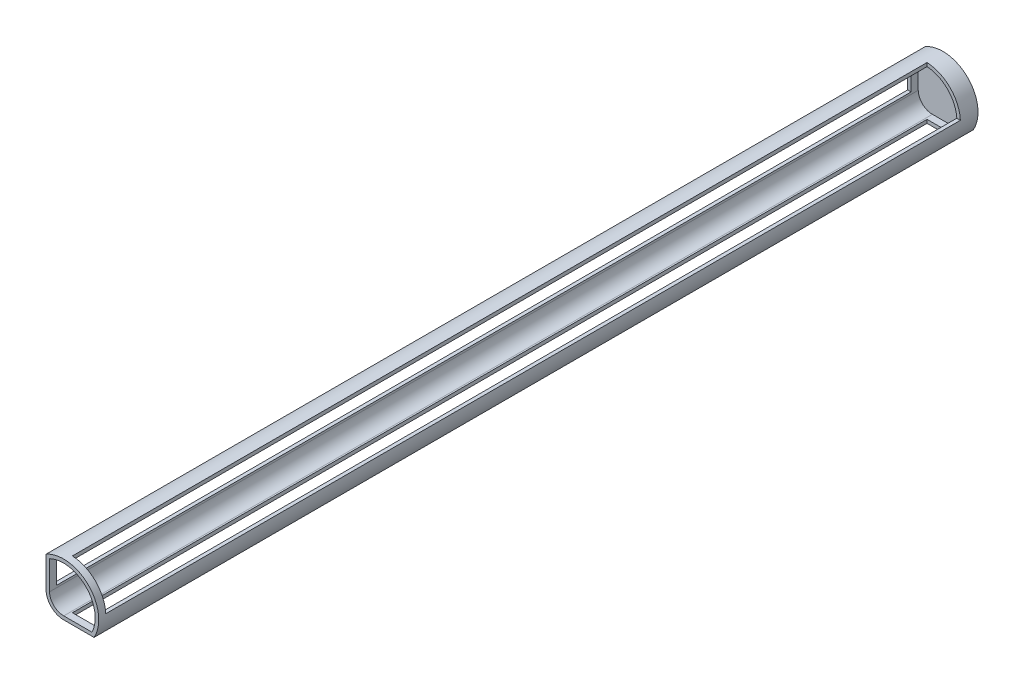
ISO-10303-21;
HEADER;
FILE_DESCRIPTION(('STEP AP214'),'2;1');
FILE_NAME('part.step','',(''),(''),'','','');
FILE_SCHEMA(('AUTOMOTIVE_DESIGN { 1 0 10303 214 1 1 1 1 }'));
ENDSEC;
DATA;
#1=APPLICATION_CONTEXT('core data for automotive mechanical design processes');
#2=APPLICATION_PROTOCOL_DEFINITION('international standard','automotive_design',2000,#1);
#3=PRODUCT_CONTEXT('',#1,'mechanical');
#4=PRODUCT('Part','Part','',(#3));
#5=PRODUCT_RELATED_PRODUCT_CATEGORY('part','',(#4));
#6=PRODUCT_DEFINITION_FORMATION('','',#4);
#7=PRODUCT_DEFINITION_CONTEXT('part definition',#1,'design');
#8=PRODUCT_DEFINITION('design','',#6,#7);
#9=PRODUCT_DEFINITION_SHAPE('','',#8);
#10=(LENGTH_UNIT() NAMED_UNIT(*) SI_UNIT(.MILLI.,.METRE.));
#11=(NAMED_UNIT(*) PLANE_ANGLE_UNIT() SI_UNIT($,.RADIAN.));
#12=(NAMED_UNIT(*) SI_UNIT($,.STERADIAN.) SOLID_ANGLE_UNIT());
#13=UNCERTAINTY_MEASURE_WITH_UNIT(LENGTH_MEASURE(1.E-05),#10,'distance_accuracy_value','');
#14=(GEOMETRIC_REPRESENTATION_CONTEXT(3) GLOBAL_UNCERTAINTY_ASSIGNED_CONTEXT((#13)) GLOBAL_UNIT_ASSIGNED_CONTEXT((#10,
#11,#12)) REPRESENTATION_CONTEXT('',''));
#15=CARTESIAN_POINT('',(0.,0.,0.));
#16=DIRECTION('',(0.,0.,1.));
#17=DIRECTION('',(1.,0.,0.));
#18=AXIS2_PLACEMENT_3D('',#15,#16,#17);
#19=CARTESIAN_POINT('',(-2.49999999999997,-2.5,250.));
#20=DIRECTION('',(0.,0.,-1.));
#21=DIRECTION('',(-1.,0.,0.));
#22=AXIS2_PLACEMENT_3D('',#19,#20,#21);
#23=CYLINDRICAL_SURFACE('',#22,9.99999999999999);
#24=DIRECTION('',(0.,0.,-1.));
#25=VECTOR('',#24,1.);
#26=CARTESIAN_POINT('',(7.48749217771911,-2.00000000000003,250.));
#27=LINE('',#26,#25);
#28=CARTESIAN_POINT('',(7.48749217771911,-2.00000000000003,5.));
#29=VERTEX_POINT('',#28);
#30=CARTESIAN_POINT('',(7.4874921777191,-2.00000000000003,248.));
#31=VERTEX_POINT('',#30);
#32=EDGE_CURVE('E231',#29,#31,#27,.F.);
#33=ORIENTED_EDGE('',*,*,#32,.T.);
#34=CARTESIAN_POINT('',(-2.49999999999997,-2.5,248.));
#35=DIRECTION('',(0.,0.,1.));
#36=DIRECTION('',(1.,0.,0.));
#37=AXIS2_PLACEMENT_3D('',#34,#35,#36);
#38=CIRCLE('',#37,9.99999999999999);
#39=CARTESIAN_POINT('',(-2.00000000000003,7.48749217771908,248.));
#40=VERTEX_POINT('',#39);
#41=EDGE_CURVE('E268',#31,#40,#38,.T.);
#42=ORIENTED_EDGE('',*,*,#41,.T.);
#43=DIRECTION('',(0.,0.,-1.));
#44=VECTOR('',#43,1.);
#45=CARTESIAN_POINT('',(-2.00000000000003,7.48749217771908,250.));
#46=LINE('',#45,#44);
#47=CARTESIAN_POINT('',(-2.,7.48749217771907,5.));
#48=VERTEX_POINT('',#47);
#49=EDGE_CURVE('E275',#40,#48,#46,.T.);
#50=ORIENTED_EDGE('',*,*,#49,.T.);
#51=CARTESIAN_POINT('',(-2.49999999999997,-2.5,5.));
#52=DIRECTION('',(0.,0.,-1.));
#53=DIRECTION('',(-1.,0.,0.));
#54=AXIS2_PLACEMENT_3D('',#51,#52,#53);
#55=CIRCLE('',#54,9.99999999999999);
#56=EDGE_CURVE('E282',#48,#29,#55,.T.);
#57=ORIENTED_EDGE('',*,*,#56,.T.);
#58=EDGE_LOOP('',(#33,#42,#50,#57));
#59=FACE_BOUND('',#58,.T.);
#60=CARTESIAN_POINT('',(-2.49999999999997,-2.5,0.));
#61=DIRECTION('',(0.,0.,1.));
#62=DIRECTION('',(-1.,0.,0.));
#63=AXIS2_PLACEMENT_3D('',#60,#61,#62);
#64=CIRCLE('',#63,9.99999999999999);
#65=CARTESIAN_POINT('',(6.16025403784441,-7.49999999999999,0.));
#66=VERTEX_POINT('',#65);
#67=CARTESIAN_POINT('',(-7.50000000000002,6.16025403784435,0.));
#68=VERTEX_POINT('',#67);
#69=EDGE_CURVE('E319',#66,#68,#64,.T.);
#70=ORIENTED_EDGE('',*,*,#69,.T.);
#71=DIRECTION('',(0.,0.,-1.));
#72=VECTOR('',#71,1.);
#73=CARTESIAN_POINT('',(-7.50000000000002,6.16025403784435,250.));
#74=LINE('',#73,#72);
#75=CARTESIAN_POINT('',(-7.50000000000002,6.16025403784435,250.));
#76=VERTEX_POINT('',#75);
#77=EDGE_CURVE('E366',#76,#68,#74,.T.);
#78=ORIENTED_EDGE('',*,*,#77,.F.);
#79=CARTESIAN_POINT('',(-2.49999999999997,-2.5,250.));
#80=DIRECTION('',(0.,0.,1.));
#81=DIRECTION('',(-1.,0.,0.));
#82=AXIS2_PLACEMENT_3D('',#79,#80,#81);
#83=CIRCLE('',#82,9.99999999999999);
#84=CARTESIAN_POINT('',(6.16025403784441,-7.49999999999999,250.));
#85=VERTEX_POINT('',#84);
#86=EDGE_CURVE('E329',#85,#76,#83,.T.);
#87=ORIENTED_EDGE('',*,*,#86,.F.);
#88=DIRECTION('',(0.,0.,-1.));
#89=VECTOR('',#88,1.);
#90=CARTESIAN_POINT('',(6.16025403784441,-7.49999999999999,250.));
#91=LINE('',#90,#89);
#92=EDGE_CURVE('E343',#85,#66,#91,.T.);
#93=ORIENTED_EDGE('',*,*,#92,.T.);
#94=EDGE_LOOP('',(#70,#78,#87,#93));
#95=FACE_BOUND('',#94,.T.);
#96=ADVANCED_FACE('F44',(#59,#95),#23,.T.);
#97=CARTESIAN_POINT('',(-7.50000000000002,6.16025403784435,250.));
#98=DIRECTION('',(1.,0.,0.));
#99=DIRECTION('',(0.,0.,-1.));
#100=AXIS2_PLACEMENT_3D('',#97,#98,#99);
#101=PLANE('',#100);
#102=DIRECTION('',(0.,0.,-1.));
#103=VECTOR('',#102,1.);
#104=CARTESIAN_POINT('',(-7.50000000000002,5.49999999999997,5.));
#105=LINE('',#104,#103);
#106=CARTESIAN_POINT('',(-7.50000000000002,5.49999999999997,248.));
#107=VERTEX_POINT('',#106);
#108=CARTESIAN_POINT('',(-7.50000000000002,5.49999999999997,5.));
#109=VERTEX_POINT('',#108);
#110=EDGE_CURVE('E194',#107,#109,#105,.T.);
#111=ORIENTED_EDGE('',*,*,#110,.F.);
#112=DIRECTION('',(0.,1.,0.));
#113=VECTOR('',#112,1.);
#114=CARTESIAN_POINT('',(-7.50000000000002,5.49999999999997,248.));
#115=LINE('',#114,#113);
#116=CARTESIAN_POINT('',(-7.50000000000002,-2.00000000000003,248.));
#117=VERTEX_POINT('',#116);
#118=EDGE_CURVE('E59',#117,#107,#115,.T.);
#119=ORIENTED_EDGE('',*,*,#118,.F.);
#120=DIRECTION('',(0.,0.,1.));
#121=VECTOR('',#120,1.);
#122=CARTESIAN_POINT('',(-7.50000000000002,-2.00000000000003,5.));
#123=LINE('',#122,#121);
#124=CARTESIAN_POINT('',(-7.50000000000002,-2.00000000000003,5.));
#125=VERTEX_POINT('',#124);
#126=EDGE_CURVE('E202',#125,#117,#123,.T.);
#127=ORIENTED_EDGE('',*,*,#126,.F.);
#128=DIRECTION('',(0.,-1.,0.));
#129=VECTOR('',#128,1.);
#130=CARTESIAN_POINT('',(-7.50000000000002,5.49999999999997,5.));
#131=LINE('',#130,#129);
#132=EDGE_CURVE('E184',#109,#125,#131,.T.);
#133=ORIENTED_EDGE('',*,*,#132,.F.);
#134=EDGE_LOOP('',(#111,#119,#127,#133));
#135=FACE_BOUND('',#134,.T.);
#136=DIRECTION('',(0.,-1.,0.));
#137=VECTOR('',#136,1.);
#138=CARTESIAN_POINT('',(-7.50000000000002,6.16025403784435,0.));
#139=LINE('',#138,#137);
#140=CARTESIAN_POINT('',(-7.50000000000002,-2.50000000000003,0.));
#141=VERTEX_POINT('',#140);
#142=EDGE_CURVE('E347',#68,#141,#139,.T.);
#143=ORIENTED_EDGE('',*,*,#142,.T.);
#144=DIRECTION('',(0.,0.,-1.));
#145=VECTOR('',#144,1.);
#146=CARTESIAN_POINT('',(-7.50000000000002,-2.50000000000003,250.));
#147=LINE('',#146,#145);
#148=CARTESIAN_POINT('',(-7.50000000000002,-2.50000000000003,250.));
#149=VERTEX_POINT('',#148);
#150=EDGE_CURVE('E362',#149,#141,#147,.T.);
#151=ORIENTED_EDGE('',*,*,#150,.F.);
#152=DIRECTION('',(0.,-1.,0.));
#153=VECTOR('',#152,1.);
#154=CARTESIAN_POINT('',(-7.50000000000002,6.16025403784435,250.));
#155=LINE('',#154,#153);
#156=EDGE_CURVE('E333',#76,#149,#155,.T.);
#157=ORIENTED_EDGE('',*,*,#156,.F.);
#158=ORIENTED_EDGE('',*,*,#77,.T.);
#159=EDGE_LOOP('',(#143,#151,#157,#158));
#160=FACE_BOUND('',#159,.T.);
#161=ADVANCED_FACE('F199',(#135,#160),#101,.F.);
#162=CARTESIAN_POINT('',(-2.50000000000003,-2.5,250.));
#163=DIRECTION('',(0.,0.,-1.));
#164=DIRECTION('',(-1.,0.,0.));
#165=AXIS2_PLACEMENT_3D('',#162,#163,#164);
#166=CYLINDRICAL_SURFACE('',#165,4.99999999999999);
#167=CARTESIAN_POINT('',(-2.50000000000003,-2.5,0.));
#168=DIRECTION('',(0.,0.,1.));
#169=DIRECTION('',(-1.,0.,0.));
#170=AXIS2_PLACEMENT_3D('',#167,#168,#169);
#171=CIRCLE('',#170,4.99999999999999);
#172=CARTESIAN_POINT('',(-2.50000000000003,-7.49999999999999,0.));
#173=VERTEX_POINT('',#172);
#174=EDGE_CURVE('E350',#141,#173,#171,.T.);
#175=ORIENTED_EDGE('',*,*,#174,.T.);
#176=DIRECTION('',(0.,0.,-1.));
#177=VECTOR('',#176,1.);
#178=CARTESIAN_POINT('',(-2.50000000000003,-7.49999999999999,250.));
#179=LINE('',#178,#177);
#180=CARTESIAN_POINT('',(-2.50000000000003,-7.49999999999999,250.));
#181=VERTEX_POINT('',#180);
#182=EDGE_CURVE('E358',#181,#173,#179,.T.);
#183=ORIENTED_EDGE('',*,*,#182,.F.);
#184=CARTESIAN_POINT('',(-2.50000000000003,-2.5,250.));
#185=DIRECTION('',(0.,0.,1.));
#186=DIRECTION('',(-1.,0.,0.));
#187=AXIS2_PLACEMENT_3D('',#184,#185,#186);
#188=CIRCLE('',#187,4.99999999999999);
#189=EDGE_CURVE('E337',#149,#181,#188,.T.);
#190=ORIENTED_EDGE('',*,*,#189,.F.);
#191=ORIENTED_EDGE('',*,*,#150,.T.);
#192=EDGE_LOOP('',(#175,#183,#190,#191));
#193=FACE_BOUND('',#192,.T.);
#194=ADVANCED_FACE('F424',(#193),#166,.T.);
#195=CARTESIAN_POINT('',(6.16025403784441,-7.49999999999999,250.));
#196=DIRECTION('',(0.,1.,0.));
#197=DIRECTION('',(0.,0.,1.));
#198=AXIS2_PLACEMENT_3D('',#195,#196,#197);
#199=PLANE('',#198);
#200=DIRECTION('',(-1.,0.,0.));
#201=VECTOR('',#200,1.);
#202=CARTESIAN_POINT('',(-2.00000000000003,-7.49999999999999,248.));
#203=LINE('',#202,#201);
#204=CARTESIAN_POINT('',(5.49999999999997,-7.49999999999999,248.));
#205=VERTEX_POINT('',#204);
#206=CARTESIAN_POINT('',(-2.00000000000003,-7.49999999999999,248.));
#207=VERTEX_POINT('',#206);
#208=EDGE_CURVE('E238',#205,#207,#203,.T.);
#209=ORIENTED_EDGE('',*,*,#208,.F.);
#210=DIRECTION('',(0.,0.,1.));
#211=VECTOR('',#210,1.);
#212=CARTESIAN_POINT('',(5.49999999999997,-7.49999999999999,248.));
#213=LINE('',#212,#211);
#214=CARTESIAN_POINT('',(5.5,-7.49999999999999,5.));
#215=VERTEX_POINT('',#214);
#216=EDGE_CURVE('E235',#215,#205,#213,.T.);
#217=ORIENTED_EDGE('',*,*,#216,.F.);
#218=DIRECTION('',(1.,0.,0.));
#219=VECTOR('',#218,1.);
#220=CARTESIAN_POINT('',(-2.,-7.49999999999999,5.));
#221=LINE('',#220,#219);
#222=CARTESIAN_POINT('',(-2.,-7.49999999999999,5.));
#223=VERTEX_POINT('',#222);
#224=EDGE_CURVE('E246',#223,#215,#221,.T.);
#225=ORIENTED_EDGE('',*,*,#224,.F.);
#226=DIRECTION('',(0.,0.,-1.));
#227=VECTOR('',#226,1.);
#228=CARTESIAN_POINT('',(-2.00000000000003,-7.49999999999999,248.));
#229=LINE('',#228,#227);
#230=EDGE_CURVE('E242',#207,#223,#229,.T.);
#231=ORIENTED_EDGE('',*,*,#230,.F.);
#232=EDGE_LOOP('',(#209,#217,#225,#231));
#233=FACE_BOUND('',#232,.T.);
#234=DIRECTION('',(1.,0.,0.));
#235=VECTOR('',#234,1.);
#236=CARTESIAN_POINT('',(6.16025403784441,-7.49999999999999,0.));
#237=LINE('',#236,#235);
#238=EDGE_CURVE('E334',#173,#66,#237,.T.);
#239=ORIENTED_EDGE('',*,*,#238,.T.);
#240=ORIENTED_EDGE('',*,*,#92,.F.);
#241=DIRECTION('',(1.,0.,0.));
#242=VECTOR('',#241,1.);
#243=CARTESIAN_POINT('',(6.16025403784441,-7.49999999999999,250.));
#244=LINE('',#243,#242);
#245=EDGE_CURVE('E340',#181,#85,#244,.T.);
#246=ORIENTED_EDGE('',*,*,#245,.F.);
#247=ORIENTED_EDGE('',*,*,#182,.T.);
#248=EDGE_LOOP('',(#239,#240,#246,#247));
#249=FACE_BOUND('',#248,.T.);
#250=ADVANCED_FACE('F398',(#233,#249),#199,.F.);
#251=CARTESIAN_POINT('',(-2.49999999999997,-2.5,250.));
#252=DIRECTION('',(0.,0.,-1.));
#253=DIRECTION('',(-1.,0.,0.));
#254=AXIS2_PLACEMENT_3D('',#251,#252,#253);
#255=PLANE('',#254);
#256=DIRECTION('',(1.,0.,0.));
#257=VECTOR('',#256,1.);
#258=CARTESIAN_POINT('',(0.796633641706377,-6.49999999999999,250.));
#259=LINE('',#258,#257);
#260=CARTESIAN_POINT('',(-2.45808929458799,-6.49999999999999,250.));
#261=VERTEX_POINT('',#260);
#262=CARTESIAN_POINT('',(5.56225774829857,-6.49999999999999,250.));
#263=VERTEX_POINT('',#262);
#264=EDGE_CURVE('E305',#261,#263,#259,.T.);
#265=ORIENTED_EDGE('',*,*,#264,.F.);
#266=CARTESIAN_POINT('',(-2.52660242536345,-2.52660242536343,250.));
#267=DIRECTION('',(0.,0.,1.));
#268=DIRECTION('',(1.,0.,0.));
#269=AXIS2_PLACEMENT_3D('',#266,#267,#268);
#270=CIRCLE('',#269,3.97398821528404);
#271=CARTESIAN_POINT('',(-6.50000000000002,-2.5951155561389,250.));
#272=VERTEX_POINT('',#271);
#273=EDGE_CURVE('E285',#272,#261,#270,.T.);
#274=ORIENTED_EDGE('',*,*,#273,.F.);
#275=DIRECTION('',(0.,-1.,0.));
#276=VECTOR('',#275,1.);
#277=CARTESIAN_POINT('',(-6.50000000000002,5.56225774829852,250.));
#278=LINE('',#277,#276);
#279=CARTESIAN_POINT('',(-6.50000000000002,5.56225774829852,250.));
#280=VERTEX_POINT('',#279);
#281=EDGE_CURVE('E291',#280,#272,#278,.T.);
#282=ORIENTED_EDGE('',*,*,#281,.F.);
#283=CARTESIAN_POINT('',(-2.52766398036111,-2.52766398036114,250.));
#284=DIRECTION('',(0.,0.,1.));
#285=DIRECTION('',(-1.,0.,0.));
#286=AXIS2_PLACEMENT_3D('',#283,#284,#285);
#287=CIRCLE('',#286,9.01256273369347);
#288=EDGE_CURVE('E309',#263,#280,#287,.T.);
#289=ORIENTED_EDGE('',*,*,#288,.F.);
#290=EDGE_LOOP('',(#265,#274,#282,#289));
#291=FACE_BOUND('',#290,.T.);
#292=ORIENTED_EDGE('',*,*,#86,.T.);
#293=ORIENTED_EDGE('',*,*,#156,.T.);
#294=ORIENTED_EDGE('',*,*,#189,.T.);
#295=ORIENTED_EDGE('',*,*,#245,.T.);
#296=EDGE_LOOP('',(#292,#293,#294,#295));
#297=FACE_BOUND('',#296,.T.);
#298=ADVANCED_FACE('F438',(#291,#297),#255,.F.);
#299=CARTESIAN_POINT('',(-2.49999999999997,-2.5,0.));
#300=DIRECTION('',(0.,0.,-1.));
#301=DIRECTION('',(-1.,0.,0.));
#302=AXIS2_PLACEMENT_3D('',#299,#300,#301);
#303=PLANE('',#302);
#304=ORIENTED_EDGE('',*,*,#69,.F.);
#305=ORIENTED_EDGE('',*,*,#238,.F.);
#306=ORIENTED_EDGE('',*,*,#174,.F.);
#307=ORIENTED_EDGE('',*,*,#142,.F.);
#308=EDGE_LOOP('',(#304,#305,#306,#307));
#309=FACE_BOUND('',#308,.T.);
#310=ADVANCED_FACE('F433',(#309),#303,.T.);
#311=CARTESIAN_POINT('',(-2.52660242536345,-2.52660242536343,3.));
#312=DIRECTION('',(0.,0.,1.));
#313=DIRECTION('',(1.,0.,0.));
#314=AXIS2_PLACEMENT_3D('',#311,#312,#313);
#315=CYLINDRICAL_SURFACE('',#314,3.97398821528404);
#316=ORIENTED_EDGE('',*,*,#273,.T.);
#317=DIRECTION('',(0.,0.,1.));
#318=VECTOR('',#317,1.);
#319=CARTESIAN_POINT('',(-2.45808929458799,-6.49999999999999,3.));
#320=LINE('',#319,#318);
#321=CARTESIAN_POINT('',(-2.45808929458799,-6.49999999999999,3.));
#322=VERTEX_POINT('',#321);
#323=EDGE_CURVE('E302',#322,#261,#320,.T.);
#324=ORIENTED_EDGE('',*,*,#323,.F.);
#325=CARTESIAN_POINT('',(-2.52660242536345,-2.52660242536343,3.));
#326=DIRECTION('',(0.,0.,1.));
#327=DIRECTION('',(1.,0.,0.));
#328=AXIS2_PLACEMENT_3D('',#325,#326,#327);
#329=CIRCLE('',#328,3.97398821528404);
#330=CARTESIAN_POINT('',(-6.50000000000002,-2.5951155561389,3.));
#331=VERTEX_POINT('',#330);
#332=EDGE_CURVE('E286',#331,#322,#329,.T.);
#333=ORIENTED_EDGE('',*,*,#332,.F.);
#334=DIRECTION('',(0.,0.,1.));
#335=VECTOR('',#334,1.);
#336=CARTESIAN_POINT('',(-6.50000000000002,-2.5951155561389,3.));
#337=LINE('',#336,#335);
#338=EDGE_CURVE('E316',#331,#272,#337,.T.);
#339=ORIENTED_EDGE('',*,*,#338,.T.);
#340=EDGE_LOOP('',(#316,#324,#333,#339));
#341=FACE_BOUND('',#340,.T.);
#342=ADVANCED_FACE('F451',(#341),#315,.F.);
#343=CARTESIAN_POINT('',(-6.50000000000002,5.56225774829852,3.));
#344=DIRECTION('',(-1.,0.,0.));
#345=DIRECTION('',(0.,0.,1.));
#346=AXIS2_PLACEMENT_3D('',#343,#344,#345);
#347=PLANE('',#346);
#348=DIRECTION('',(0.,0.,1.));
#349=VECTOR('',#348,1.);
#350=CARTESIAN_POINT('',(-6.50000000000002,-2.00000000000003,3.));
#351=LINE('',#350,#349);
#352=CARTESIAN_POINT('',(-6.50000000000003,-2.00000000000003,5.));
#353=VERTEX_POINT('',#352);
#354=CARTESIAN_POINT('',(-6.50000000000003,-2.00000000000003,248.));
#355=VERTEX_POINT('',#354);
#356=EDGE_CURVE('E227',#353,#355,#351,.T.);
#357=ORIENTED_EDGE('',*,*,#356,.T.);
#358=DIRECTION('',(0.,1.,0.));
#359=VECTOR('',#358,1.);
#360=CARTESIAN_POINT('',(-6.50000000000002,5.56225774829852,248.));
#361=LINE('',#360,#359);
#362=CARTESIAN_POINT('',(-6.50000000000003,5.49999999999997,248.));
#363=VERTEX_POINT('',#362);
#364=EDGE_CURVE('E223',#355,#363,#361,.T.);
#365=ORIENTED_EDGE('',*,*,#364,.T.);
#366=DIRECTION('',(0.,0.,-1.));
#367=VECTOR('',#366,1.);
#368=CARTESIAN_POINT('',(-6.50000000000002,5.49999999999997,3.));
#369=LINE('',#368,#367);
#370=CARTESIAN_POINT('',(-6.50000000000002,5.49999999999997,5.));
#371=VERTEX_POINT('',#370);
#372=EDGE_CURVE('E218',#363,#371,#369,.T.);
#373=ORIENTED_EDGE('',*,*,#372,.T.);
#374=DIRECTION('',(0.,-1.,0.));
#375=VECTOR('',#374,1.);
#376=CARTESIAN_POINT('',(-6.50000000000002,5.56225774829852,5.));
#377=LINE('',#376,#375);
#378=EDGE_CURVE('E187',#371,#353,#377,.T.);
#379=ORIENTED_EDGE('',*,*,#378,.T.);
#380=EDGE_LOOP('',(#357,#365,#373,#379));
#381=FACE_BOUND('',#380,.T.);
#382=ORIENTED_EDGE('',*,*,#281,.T.);
#383=ORIENTED_EDGE('',*,*,#338,.F.);
#384=DIRECTION('',(0.,-1.,0.));
#385=VECTOR('',#384,1.);
#386=CARTESIAN_POINT('',(-6.50000000000002,5.56225774829852,3.));
#387=LINE('',#386,#385);
#388=CARTESIAN_POINT('',(-6.50000000000002,5.56225774829852,3.));
#389=VERTEX_POINT('',#388);
#390=EDGE_CURVE('E298',#389,#331,#387,.T.);
#391=ORIENTED_EDGE('',*,*,#390,.F.);
#392=DIRECTION('',(0.,0.,1.));
#393=VECTOR('',#392,1.);
#394=CARTESIAN_POINT('',(-6.50000000000002,5.56225774829852,3.));
#395=LINE('',#394,#393);
#396=EDGE_CURVE('E320',#389,#280,#395,.T.);
#397=ORIENTED_EDGE('',*,*,#396,.T.);
#398=EDGE_LOOP('',(#382,#383,#391,#397));
#399=FACE_BOUND('',#398,.T.);
#400=ADVANCED_FACE('F457',(#381,#399),#347,.F.);
#401=CARTESIAN_POINT('',(-2.52766398036111,-2.52766398036114,3.));
#402=DIRECTION('',(0.,0.,1.));
#403=DIRECTION('',(1.,0.,0.));
#404=AXIS2_PLACEMENT_3D('',#401,#402,#403);
#405=CYLINDRICAL_SURFACE('',#404,9.01256273369347);
#406=CARTESIAN_POINT('',(-2.52766398036111,-2.52766398036114,248.));
#407=DIRECTION('',(0.,0.,1.));
#408=DIRECTION('',(1.,0.,0.));
#409=AXIS2_PLACEMENT_3D('',#406,#407,#408);
#410=CIRCLE('',#409,9.01256273369347);
#411=CARTESIAN_POINT('',(-2.00000000000003,6.46943876177701,248.));
#412=VERTEX_POINT('',#411);
#413=CARTESIAN_POINT('',(6.46943876177702,-2.00000000000003,248.));
#414=VERTEX_POINT('',#413);
#415=EDGE_CURVE('E254',#412,#414,#410,.F.);
#416=ORIENTED_EDGE('',*,*,#415,.T.);
#417=DIRECTION('',(0.,0.,1.));
#418=VECTOR('',#417,1.);
#419=CARTESIAN_POINT('',(6.46943876177704,-2.00000000000003,3.));
#420=LINE('',#419,#418);
#421=CARTESIAN_POINT('',(6.46943876177704,-2.00000000000003,5.));
#422=VERTEX_POINT('',#421);
#423=EDGE_CURVE('E11',#414,#422,#420,.F.);
#424=ORIENTED_EDGE('',*,*,#423,.T.);
#425=CARTESIAN_POINT('',(-2.52766398036111,-2.52766398036114,5.));
#426=DIRECTION('',(0.,0.,-1.));
#427=DIRECTION('',(-1.,0.,0.));
#428=AXIS2_PLACEMENT_3D('',#425,#426,#427);
#429=CIRCLE('',#428,9.01256273369347);
#430=CARTESIAN_POINT('',(-2.,6.46943876177702,5.));
#431=VERTEX_POINT('',#430);
#432=EDGE_CURVE('E279',#422,#431,#429,.F.);
#433=ORIENTED_EDGE('',*,*,#432,.T.);
#434=DIRECTION('',(0.,0.,1.));
#435=VECTOR('',#434,1.);
#436=CARTESIAN_POINT('',(-2.,6.46943876177701,3.));
#437=LINE('',#436,#435);
#438=EDGE_CURVE('E271',#431,#412,#437,.T.);
#439=ORIENTED_EDGE('',*,*,#438,.T.);
#440=EDGE_LOOP('',(#416,#424,#433,#439));
#441=FACE_BOUND('',#440,.T.);
#442=ORIENTED_EDGE('',*,*,#288,.T.);
#443=ORIENTED_EDGE('',*,*,#396,.F.);
#444=CARTESIAN_POINT('',(-2.52766398036111,-2.52766398036114,3.));
#445=DIRECTION('',(0.,0.,1.));
#446=DIRECTION('',(-1.,0.,0.));
#447=AXIS2_PLACEMENT_3D('',#444,#445,#446);
#448=CIRCLE('',#447,9.01256273369347);
#449=CARTESIAN_POINT('',(5.56225774829857,-6.49999999999999,3.));
#450=VERTEX_POINT('',#449);
#451=EDGE_CURVE('E294',#450,#389,#448,.T.);
#452=ORIENTED_EDGE('',*,*,#451,.F.);
#453=DIRECTION('',(0.,0.,1.));
#454=VECTOR('',#453,1.);
#455=CARTESIAN_POINT('',(5.56225774829857,-6.49999999999999,3.));
#456=LINE('',#455,#454);
#457=EDGE_CURVE('E323',#450,#263,#456,.T.);
#458=ORIENTED_EDGE('',*,*,#457,.T.);
#459=EDGE_LOOP('',(#442,#443,#452,#458));
#460=FACE_BOUND('',#459,.T.);
#461=ADVANCED_FACE('F461',(#441,#460),#405,.F.);
#462=CARTESIAN_POINT('',(0.796633641706377,-6.49999999999999,3.));
#463=DIRECTION('',(0.,-1.,0.));
#464=DIRECTION('',(0.,0.,-1.));
#465=AXIS2_PLACEMENT_3D('',#462,#463,#464);
#466=PLANE('',#465);
#467=DIRECTION('',(1.,0.,0.));
#468=VECTOR('',#467,1.);
#469=CARTESIAN_POINT('',(0.796633641706377,-6.49999999999999,5.));
#470=LINE('',#469,#468);
#471=CARTESIAN_POINT('',(-2.,-6.50000000000001,5.));
#472=VERTEX_POINT('',#471);
#473=CARTESIAN_POINT('',(5.5,-6.50000000000001,5.));
#474=VERTEX_POINT('',#473);
#475=EDGE_CURVE('E378',#472,#474,#470,.T.);
#476=ORIENTED_EDGE('',*,*,#475,.T.);
#477=DIRECTION('',(0.,0.,1.));
#478=VECTOR('',#477,1.);
#479=CARTESIAN_POINT('',(5.5,-6.49999999999999,3.));
#480=LINE('',#479,#478);
#481=CARTESIAN_POINT('',(5.49999999999997,-6.50000000000001,248.));
#482=VERTEX_POINT('',#481);
#483=EDGE_CURVE('E52',#474,#482,#480,.T.);
#484=ORIENTED_EDGE('',*,*,#483,.T.);
#485=DIRECTION('',(-1.,0.,0.));
#486=VECTOR('',#485,1.);
#487=CARTESIAN_POINT('',(0.796633641706377,-6.49999999999999,248.));
#488=LINE('',#487,#486);
#489=CARTESIAN_POINT('',(-2.00000000000003,-6.49999999999999,248.));
#490=VERTEX_POINT('',#489);
#491=EDGE_CURVE('E370',#482,#490,#488,.T.);
#492=ORIENTED_EDGE('',*,*,#491,.T.);
#493=DIRECTION('',(0.,0.,-1.));
#494=VECTOR('',#493,1.);
#495=CARTESIAN_POINT('',(-2.,-6.49999999999999,3.));
#496=LINE('',#495,#494);
#497=EDGE_CURVE('E374',#490,#472,#496,.T.);
#498=ORIENTED_EDGE('',*,*,#497,.T.);
#499=EDGE_LOOP('',(#476,#484,#492,#498));
#500=FACE_BOUND('',#499,.T.);
#501=ORIENTED_EDGE('',*,*,#264,.T.);
#502=ORIENTED_EDGE('',*,*,#457,.F.);
#503=DIRECTION('',(1.,0.,0.));
#504=VECTOR('',#503,1.);
#505=CARTESIAN_POINT('',(0.796633641706377,-6.49999999999999,3.));
#506=LINE('',#505,#504);
#507=EDGE_CURVE('E290',#322,#450,#506,.T.);
#508=ORIENTED_EDGE('',*,*,#507,.F.);
#509=ORIENTED_EDGE('',*,*,#323,.T.);
#510=EDGE_LOOP('',(#501,#502,#508,#509));
#511=FACE_BOUND('',#510,.T.);
#512=ADVANCED_FACE('F384',(#500,#511),#466,.F.);
#513=CARTESIAN_POINT('',(-2.52660242536345,-2.52660242536343,3.));
#514=DIRECTION('',(0.,0.,1.));
#515=DIRECTION('',(1.,0.,0.));
#516=AXIS2_PLACEMENT_3D('',#513,#514,#515);
#517=PLANE('',#516);
#518=ORIENTED_EDGE('',*,*,#332,.T.);
#519=ORIENTED_EDGE('',*,*,#507,.T.);
#520=ORIENTED_EDGE('',*,*,#451,.T.);
#521=ORIENTED_EDGE('',*,*,#390,.T.);
#522=EDGE_LOOP('',(#518,#519,#520,#521));
#523=FACE_BOUND('',#522,.T.);
#524=ADVANCED_FACE('F414',(#523),#517,.T.);
#525=CARTESIAN_POINT('',(-2.00000000000003,237.5,248.));
#526=DIRECTION('',(0.,0.,1.));
#527=DIRECTION('',(1.,0.,0.));
#528=AXIS2_PLACEMENT_3D('',#525,#526,#527);
#529=PLANE('',#528);
#530=DIRECTION('',(0.,-1.,0.));
#531=VECTOR('',#530,1.);
#532=CARTESIAN_POINT('',(5.49999999999997,237.5,248.));
#533=LINE('',#532,#531);
#534=EDGE_CURVE('E250',#482,#205,#533,.T.);
#535=ORIENTED_EDGE('',*,*,#534,.T.);
#536=ORIENTED_EDGE('',*,*,#208,.T.);
#537=DIRECTION('',(0.,-1.,0.));
#538=VECTOR('',#537,1.);
#539=CARTESIAN_POINT('',(-2.00000000000003,237.5,248.));
#540=LINE('',#539,#538);
#541=EDGE_CURVE('E260',#490,#207,#540,.T.);
#542=ORIENTED_EDGE('',*,*,#541,.F.);
#543=ORIENTED_EDGE('',*,*,#491,.F.);
#544=EDGE_LOOP('',(#535,#536,#542,#543));
#545=FACE_BOUND('',#544,.T.);
#546=ADVANCED_FACE('F401',(#545),#529,.F.);
#547=CARTESIAN_POINT('',(-2.00000000000003,237.5,248.));
#548=DIRECTION('',(-1.,0.,0.));
#549=DIRECTION('',(0.,0.,1.));
#550=AXIS2_PLACEMENT_3D('',#547,#548,#549);
#551=PLANE('',#550);
#552=ORIENTED_EDGE('',*,*,#541,.T.);
#553=ORIENTED_EDGE('',*,*,#230,.T.);
#554=DIRECTION('',(0.,-1.,0.));
#555=VECTOR('',#554,1.);
#556=CARTESIAN_POINT('',(-2.,237.5,5.));
#557=LINE('',#556,#555);
#558=EDGE_CURVE('E256',#472,#223,#557,.T.);
#559=ORIENTED_EDGE('',*,*,#558,.F.);
#560=ORIENTED_EDGE('',*,*,#497,.F.);
#561=EDGE_LOOP('',(#552,#553,#559,#560));
#562=FACE_BOUND('',#561,.T.);
#563=ADVANCED_FACE('F404',(#562),#551,.F.);
#564=CARTESIAN_POINT('',(-2.,237.5,5.));
#565=DIRECTION('',(0.,0.,-1.));
#566=DIRECTION('',(-1.,0.,0.));
#567=AXIS2_PLACEMENT_3D('',#564,#565,#566);
#568=PLANE('',#567);
#569=ORIENTED_EDGE('',*,*,#558,.T.);
#570=ORIENTED_EDGE('',*,*,#224,.T.);
#571=DIRECTION('',(0.,-1.,0.));
#572=VECTOR('',#571,1.);
#573=CARTESIAN_POINT('',(5.5,237.5,5.));
#574=LINE('',#573,#572);
#575=EDGE_CURVE('E251',#474,#215,#574,.T.);
#576=ORIENTED_EDGE('',*,*,#575,.F.);
#577=ORIENTED_EDGE('',*,*,#475,.F.);
#578=EDGE_LOOP('',(#569,#570,#576,#577));
#579=FACE_BOUND('',#578,.T.);
#580=ADVANCED_FACE('F391',(#579),#568,.F.);
#581=CARTESIAN_POINT('',(5.49999999999997,237.5,248.));
#582=DIRECTION('',(1.,0.,0.));
#583=DIRECTION('',(0.,0.,-1.));
#584=AXIS2_PLACEMENT_3D('',#581,#582,#583);
#585=PLANE('',#584);
#586=ORIENTED_EDGE('',*,*,#575,.T.);
#587=ORIENTED_EDGE('',*,*,#216,.T.);
#588=ORIENTED_EDGE('',*,*,#534,.F.);
#589=ORIENTED_EDGE('',*,*,#483,.F.);
#590=EDGE_LOOP('',(#586,#587,#588,#589));
#591=FACE_BOUND('',#590,.T.);
#592=ADVANCED_FACE('F389',(#591),#585,.F.);
#593=EDGE_CURVE('E255',#48,#431,#557,.T.);
#594=ORIENTED_EDGE('',*,*,#593,.T.);
#595=ORIENTED_EDGE('',*,*,#432,.F.);
#596=DIRECTION('',(-1.,0.,0.));
#597=VECTOR('',#596,1.);
#598=CARTESIAN_POINT('',(237.5,-2.00000000000003,5.));
#599=LINE('',#598,#597);
#600=EDGE_CURVE('E213',#29,#422,#599,.T.);
#601=ORIENTED_EDGE('',*,*,#600,.F.);
#602=ORIENTED_EDGE('',*,*,#56,.F.);
#603=EDGE_LOOP('',(#594,#595,#601,#602));
#604=FACE_BOUND('',#603,.T.);
#605=ADVANCED_FACE('F413',(#604),#568,.F.);
#606=EDGE_CURVE('E259',#40,#412,#540,.T.);
#607=ORIENTED_EDGE('',*,*,#606,.T.);
#608=ORIENTED_EDGE('',*,*,#438,.F.);
#609=ORIENTED_EDGE('',*,*,#593,.F.);
#610=ORIENTED_EDGE('',*,*,#49,.F.);
#611=EDGE_LOOP('',(#607,#608,#609,#610));
#612=FACE_BOUND('',#611,.T.);
#613=ADVANCED_FACE('F407',(#612),#551,.F.);
#614=ORIENTED_EDGE('',*,*,#606,.F.);
#615=ORIENTED_EDGE('',*,*,#41,.F.);
#616=DIRECTION('',(-1.,0.,0.));
#617=VECTOR('',#616,1.);
#618=CARTESIAN_POINT('',(237.5,-2.00000000000003,248.));
#619=LINE('',#618,#617);
#620=EDGE_CURVE('E212',#31,#414,#619,.T.);
#621=ORIENTED_EDGE('',*,*,#620,.T.);
#622=ORIENTED_EDGE('',*,*,#415,.F.);
#623=EDGE_LOOP('',(#614,#615,#621,#622));
#624=FACE_BOUND('',#623,.T.);
#625=ADVANCED_FACE('F416',(#624),#529,.F.);
#626=CARTESIAN_POINT('',(237.5,-2.00000000000003,5.));
#627=DIRECTION('',(0.,-1.,0.));
#628=DIRECTION('',(0.,0.,-1.));
#629=AXIS2_PLACEMENT_3D('',#626,#627,#628);
#630=PLANE('',#629);
#631=ORIENTED_EDGE('',*,*,#600,.T.);
#632=ORIENTED_EDGE('',*,*,#423,.F.);
#633=ORIENTED_EDGE('',*,*,#620,.F.);
#634=ORIENTED_EDGE('',*,*,#32,.F.);
#635=EDGE_LOOP('',(#631,#632,#633,#634));
#636=FACE_BOUND('',#635,.T.);
#637=ADVANCED_FACE('F473',(#636),#630,.F.);
#638=EDGE_CURVE('E190',#353,#125,#599,.T.);
#639=ORIENTED_EDGE('',*,*,#638,.T.);
#640=ORIENTED_EDGE('',*,*,#126,.T.);
#641=EDGE_CURVE('E209',#355,#117,#619,.T.);
#642=ORIENTED_EDGE('',*,*,#641,.F.);
#643=ORIENTED_EDGE('',*,*,#356,.F.);
#644=EDGE_LOOP('',(#639,#640,#642,#643));
#645=FACE_BOUND('',#644,.T.);
#646=ADVANCED_FACE('F479',(#645),#630,.F.);
#647=CARTESIAN_POINT('',(237.5,5.49999999999997,248.));
#648=DIRECTION('',(0.,0.,1.));
#649=DIRECTION('',(1.,0.,0.));
#650=AXIS2_PLACEMENT_3D('',#647,#648,#649);
#651=PLANE('',#650);
#652=ORIENTED_EDGE('',*,*,#641,.T.);
#653=ORIENTED_EDGE('',*,*,#118,.T.);
#654=DIRECTION('',(-1.,0.,0.));
#655=VECTOR('',#654,1.);
#656=CARTESIAN_POINT('',(237.5,5.49999999999997,248.));
#657=LINE('',#656,#655);
#658=EDGE_CURVE('E191',#363,#107,#657,.T.);
#659=ORIENTED_EDGE('',*,*,#658,.F.);
#660=ORIENTED_EDGE('',*,*,#364,.F.);
#661=EDGE_LOOP('',(#652,#653,#659,#660));
#662=FACE_BOUND('',#661,.T.);
#663=ADVANCED_FACE('F512',(#662),#651,.F.);
#664=CARTESIAN_POINT('',(237.5,5.49999999999997,5.));
#665=DIRECTION('',(0.,0.,-1.));
#666=DIRECTION('',(0.,1.,0.));
#667=AXIS2_PLACEMENT_3D('',#664,#665,#666);
#668=PLANE('',#667);
#669=DIRECTION('',(-1.,0.,0.));
#670=VECTOR('',#669,1.);
#671=CARTESIAN_POINT('',(237.5,5.49999999999997,5.));
#672=LINE('',#671,#670);
#673=EDGE_CURVE('E67',#371,#109,#672,.T.);
#674=ORIENTED_EDGE('',*,*,#673,.T.);
#675=ORIENTED_EDGE('',*,*,#132,.T.);
#676=ORIENTED_EDGE('',*,*,#638,.F.);
#677=ORIENTED_EDGE('',*,*,#378,.F.);
#678=EDGE_LOOP('',(#674,#675,#676,#677));
#679=FACE_BOUND('',#678,.T.);
#680=ADVANCED_FACE('F181',(#679),#668,.F.);
#681=CARTESIAN_POINT('',(237.5,5.49999999999997,5.));
#682=DIRECTION('',(0.,1.,0.));
#683=DIRECTION('',(0.,0.,1.));
#684=AXIS2_PLACEMENT_3D('',#681,#682,#683);
#685=PLANE('',#684);
#686=ORIENTED_EDGE('',*,*,#658,.T.);
#687=ORIENTED_EDGE('',*,*,#110,.T.);
#688=ORIENTED_EDGE('',*,*,#673,.F.);
#689=ORIENTED_EDGE('',*,*,#372,.F.);
#690=EDGE_LOOP('',(#686,#687,#688,#689));
#691=FACE_BOUND('',#690,.T.);
#692=ADVANCED_FACE('F195',(#691),#685,.F.);
#693=CLOSED_SHELL('',(#96,#161,#194,#250,#298,#310,#342,#400,#461,#512,#524,#546,#563,#580,#592,
#605,#613,#625,#637,#646,#663,#680,#692));
#694=MANIFOLD_SOLID_BREP('B2',#693);
#695=ADVANCED_BREP_SHAPE_REPRESENTATION('',(#18,#694),#14);
#696=SHAPE_DEFINITION_REPRESENTATION(#9,#695);
ENDSEC;
END-ISO-10303-21;
